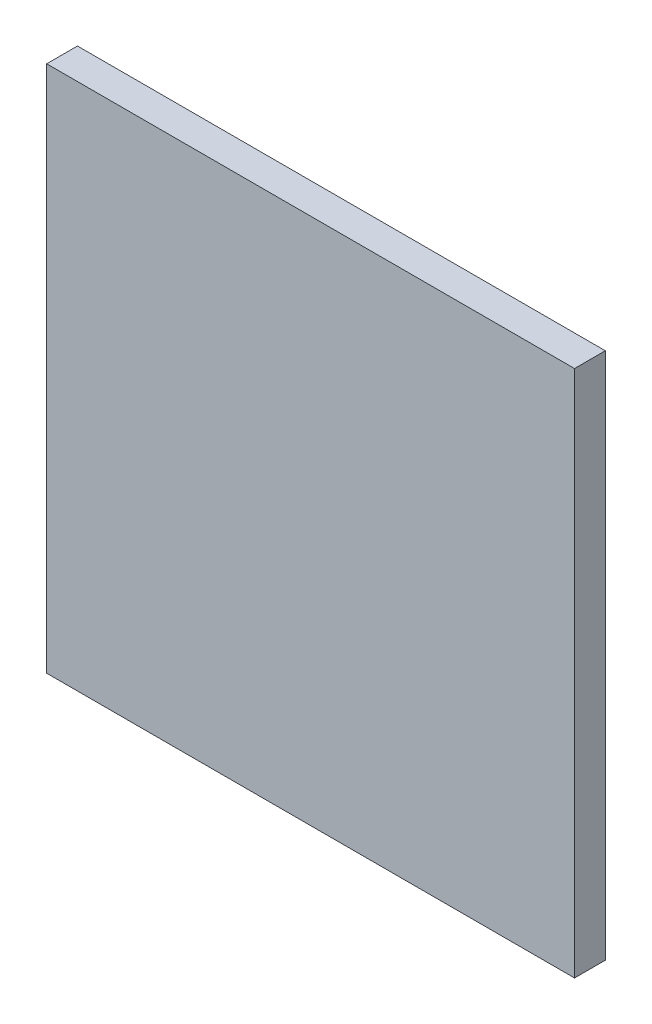
ISO-10303-21;
HEADER;
FILE_DESCRIPTION(('STEP AP214'),'2;1');
FILE_NAME('part.step','',(''),(''),'','','');
FILE_SCHEMA(('AUTOMOTIVE_DESIGN { 1 0 10303 214 1 1 1 1 }'));
ENDSEC;
DATA;
#1=APPLICATION_CONTEXT('core data for automotive mechanical design processes');
#2=APPLICATION_PROTOCOL_DEFINITION('international standard','automotive_design',2000,#1);
#3=PRODUCT_CONTEXT('',#1,'mechanical');
#4=PRODUCT('Part','Part','',(#3));
#5=PRODUCT_RELATED_PRODUCT_CATEGORY('part','',(#4));
#6=PRODUCT_DEFINITION_FORMATION('','',#4);
#7=PRODUCT_DEFINITION_CONTEXT('part definition',#1,'design');
#8=PRODUCT_DEFINITION('design','',#6,#7);
#9=PRODUCT_DEFINITION_SHAPE('','',#8);
#10=(LENGTH_UNIT() NAMED_UNIT(*) SI_UNIT(.MILLI.,.METRE.));
#11=(NAMED_UNIT(*) PLANE_ANGLE_UNIT() SI_UNIT($,.RADIAN.));
#12=(NAMED_UNIT(*) SI_UNIT($,.STERADIAN.) SOLID_ANGLE_UNIT());
#13=UNCERTAINTY_MEASURE_WITH_UNIT(LENGTH_MEASURE(1.E-05),#10,'distance_accuracy_value','');
#14=(GEOMETRIC_REPRESENTATION_CONTEXT(3) GLOBAL_UNCERTAINTY_ASSIGNED_CONTEXT((#13)) GLOBAL_UNIT_ASSIGNED_CONTEXT((#10,
#11,#12)) REPRESENTATION_CONTEXT('',''));
#15=CARTESIAN_POINT('',(0.,0.,0.));
#16=DIRECTION('',(0.,0.,1.));
#17=DIRECTION('',(1.,0.,0.));
#18=AXIS2_PLACEMENT_3D('',#15,#16,#17);
#19=CARTESIAN_POINT('',(47.625,-47.625,5.55625));
#20=DIRECTION('',(-1.,0.,0.));
#21=DIRECTION('',(0.,0.,1.));
#22=AXIS2_PLACEMENT_3D('',#19,#20,#21);
#23=PLANE('',#22);
#24=DIRECTION('',(0.,1.,0.));
#25=VECTOR('',#24,1.);
#26=CARTESIAN_POINT('',(47.625,-47.625,0.));
#27=LINE('',#26,#25);
#28=CARTESIAN_POINT('',(47.625,-47.625,0.));
#29=VERTEX_POINT('',#28);
#30=CARTESIAN_POINT('',(47.625,47.625,0.));
#31=VERTEX_POINT('',#30);
#32=EDGE_CURVE('E103',#29,#31,#27,.T.);
#33=ORIENTED_EDGE('',*,*,#32,.T.);
#34=DIRECTION('',(0.,0.,-1.));
#35=VECTOR('',#34,1.);
#36=CARTESIAN_POINT('',(47.625,47.625,5.55625));
#37=LINE('',#36,#35);
#38=CARTESIAN_POINT('',(47.625,47.625,5.55625));
#39=VERTEX_POINT('',#38);
#40=EDGE_CURVE('E11',#39,#31,#37,.T.);
#41=ORIENTED_EDGE('',*,*,#40,.F.);
#42=DIRECTION('',(0.,1.,0.));
#43=VECTOR('',#42,1.);
#44=CARTESIAN_POINT('',(47.625,-47.625,5.55625));
#45=LINE('',#44,#43);
#46=CARTESIAN_POINT('',(47.625,-47.625,5.55625));
#47=VERTEX_POINT('',#46);
#48=EDGE_CURVE('E91',#47,#39,#45,.T.);
#49=ORIENTED_EDGE('',*,*,#48,.F.);
#50=DIRECTION('',(0.,0.,-1.));
#51=VECTOR('',#50,1.);
#52=CARTESIAN_POINT('',(47.625,-47.625,5.55625));
#53=LINE('',#52,#51);
#54=EDGE_CURVE('E99',#47,#29,#53,.T.);
#55=ORIENTED_EDGE('',*,*,#54,.T.);
#56=EDGE_LOOP('',(#33,#41,#49,#55));
#57=FACE_BOUND('',#56,.T.);
#58=ADVANCED_FACE('F40',(#57),#23,.F.);
#59=CARTESIAN_POINT('',(-47.625,47.625,5.55625));
#60=DIRECTION('',(0.,-1.,0.));
#61=DIRECTION('',(0.,0.,-1.));
#62=AXIS2_PLACEMENT_3D('',#59,#60,#61);
#63=PLANE('',#62);
#64=DIRECTION('',(-1.,0.,0.));
#65=VECTOR('',#64,1.);
#66=CARTESIAN_POINT('',(-47.625,47.625,0.));
#67=LINE('',#66,#65);
#68=CARTESIAN_POINT('',(-47.625,47.625,0.));
#69=VERTEX_POINT('',#68);
#70=EDGE_CURVE('E95',#31,#69,#67,.T.);
#71=ORIENTED_EDGE('',*,*,#70,.T.);
#72=DIRECTION('',(0.,0.,-1.));
#73=VECTOR('',#72,1.);
#74=CARTESIAN_POINT('',(-47.625,47.625,5.55625));
#75=LINE('',#74,#73);
#76=CARTESIAN_POINT('',(-47.625,47.625,5.55625));
#77=VERTEX_POINT('',#76);
#78=EDGE_CURVE('E48',#77,#69,#75,.T.);
#79=ORIENTED_EDGE('',*,*,#78,.F.);
#80=DIRECTION('',(-1.,0.,0.));
#81=VECTOR('',#80,1.);
#82=CARTESIAN_POINT('',(-47.625,47.625,5.55625));
#83=LINE('',#82,#81);
#84=EDGE_CURVE('E86',#39,#77,#83,.T.);
#85=ORIENTED_EDGE('',*,*,#84,.F.);
#86=ORIENTED_EDGE('',*,*,#40,.T.);
#87=EDGE_LOOP('',(#71,#79,#85,#86));
#88=FACE_BOUND('',#87,.T.);
#89=ADVANCED_FACE('F94',(#88),#63,.F.);
#90=CARTESIAN_POINT('',(-47.625,-47.625,5.55625));
#91=DIRECTION('',(1.,0.,0.));
#92=DIRECTION('',(0.,0.,-1.));
#93=AXIS2_PLACEMENT_3D('',#90,#91,#92);
#94=PLANE('',#93);
#95=DIRECTION('',(0.,-1.,0.));
#96=VECTOR('',#95,1.);
#97=CARTESIAN_POINT('',(-47.625,-47.625,0.));
#98=LINE('',#97,#96);
#99=CARTESIAN_POINT('',(-47.625,-47.625,0.));
#100=VERTEX_POINT('',#99);
#101=EDGE_CURVE('E73',#69,#100,#98,.T.);
#102=ORIENTED_EDGE('',*,*,#101,.T.);
#103=DIRECTION('',(0.,0.,-1.));
#104=VECTOR('',#103,1.);
#105=CARTESIAN_POINT('',(-47.625,-47.625,5.55625));
#106=LINE('',#105,#104);
#107=CARTESIAN_POINT('',(-47.625,-47.625,5.55625));
#108=VERTEX_POINT('',#107);
#109=EDGE_CURVE('E96',#108,#100,#106,.T.);
#110=ORIENTED_EDGE('',*,*,#109,.F.);
#111=DIRECTION('',(0.,-1.,0.));
#112=VECTOR('',#111,1.);
#113=CARTESIAN_POINT('',(-47.625,-47.625,5.55625));
#114=LINE('',#113,#112);
#115=EDGE_CURVE('E89',#77,#108,#114,.T.);
#116=ORIENTED_EDGE('',*,*,#115,.F.);
#117=ORIENTED_EDGE('',*,*,#78,.T.);
#118=EDGE_LOOP('',(#102,#110,#116,#117));
#119=FACE_BOUND('',#118,.T.);
#120=ADVANCED_FACE('F97',(#119),#94,.F.);
#121=CARTESIAN_POINT('',(-47.625,-47.625,5.55625));
#122=DIRECTION('',(0.,1.,0.));
#123=DIRECTION('',(0.,0.,1.));
#124=AXIS2_PLACEMENT_3D('',#121,#122,#123);
#125=PLANE('',#124);
#126=DIRECTION('',(1.,0.,0.));
#127=VECTOR('',#126,1.);
#128=CARTESIAN_POINT('',(-47.625,-47.625,0.));
#129=LINE('',#128,#127);
#130=EDGE_CURVE('E79',#100,#29,#129,.T.);
#131=ORIENTED_EDGE('',*,*,#130,.T.);
#132=ORIENTED_EDGE('',*,*,#54,.F.);
#133=DIRECTION('',(1.,0.,0.));
#134=VECTOR('',#133,1.);
#135=CARTESIAN_POINT('',(-47.625,-47.625,5.55625));
#136=LINE('',#135,#134);
#137=EDGE_CURVE('E56',#108,#47,#136,.T.);
#138=ORIENTED_EDGE('',*,*,#137,.F.);
#139=ORIENTED_EDGE('',*,*,#109,.T.);
#140=EDGE_LOOP('',(#131,#132,#138,#139));
#141=FACE_BOUND('',#140,.T.);
#142=ADVANCED_FACE('F110',(#141),#125,.F.);
#143=CARTESIAN_POINT('',(0.,0.,5.55625));
#144=DIRECTION('',(0.,0.,-1.));
#145=DIRECTION('',(-1.,0.,0.));
#146=AXIS2_PLACEMENT_3D('',#143,#144,#145);
#147=PLANE('',#146);
#148=ORIENTED_EDGE('',*,*,#48,.T.);
#149=ORIENTED_EDGE('',*,*,#84,.T.);
#150=ORIENTED_EDGE('',*,*,#115,.T.);
#151=ORIENTED_EDGE('',*,*,#137,.T.);
#152=EDGE_LOOP('',(#148,#149,#150,#151));
#153=FACE_BOUND('',#152,.T.);
#154=ADVANCED_FACE('F87',(#153),#147,.F.);
#155=CARTESIAN_POINT('',(0.,0.,0.));
#156=DIRECTION('',(0.,0.,-1.));
#157=DIRECTION('',(-1.,0.,0.));
#158=AXIS2_PLACEMENT_3D('',#155,#156,#157);
#159=PLANE('',#158);
#160=ORIENTED_EDGE('',*,*,#32,.F.);
#161=ORIENTED_EDGE('',*,*,#130,.F.);
#162=ORIENTED_EDGE('',*,*,#101,.F.);
#163=ORIENTED_EDGE('',*,*,#70,.F.);
#164=EDGE_LOOP('',(#160,#161,#162,#163));
#165=FACE_BOUND('',#164,.T.);
#166=ADVANCED_FACE('F113',(#165),#159,.T.);
#167=CLOSED_SHELL('',(#58,#89,#120,#142,#154,#166));
#168=MANIFOLD_SOLID_BREP('B2',#167);
#169=ADVANCED_BREP_SHAPE_REPRESENTATION('',(#18,#168),#14);
#170=SHAPE_DEFINITION_REPRESENTATION(#9,#169);
ENDSEC;
END-ISO-10303-21;
